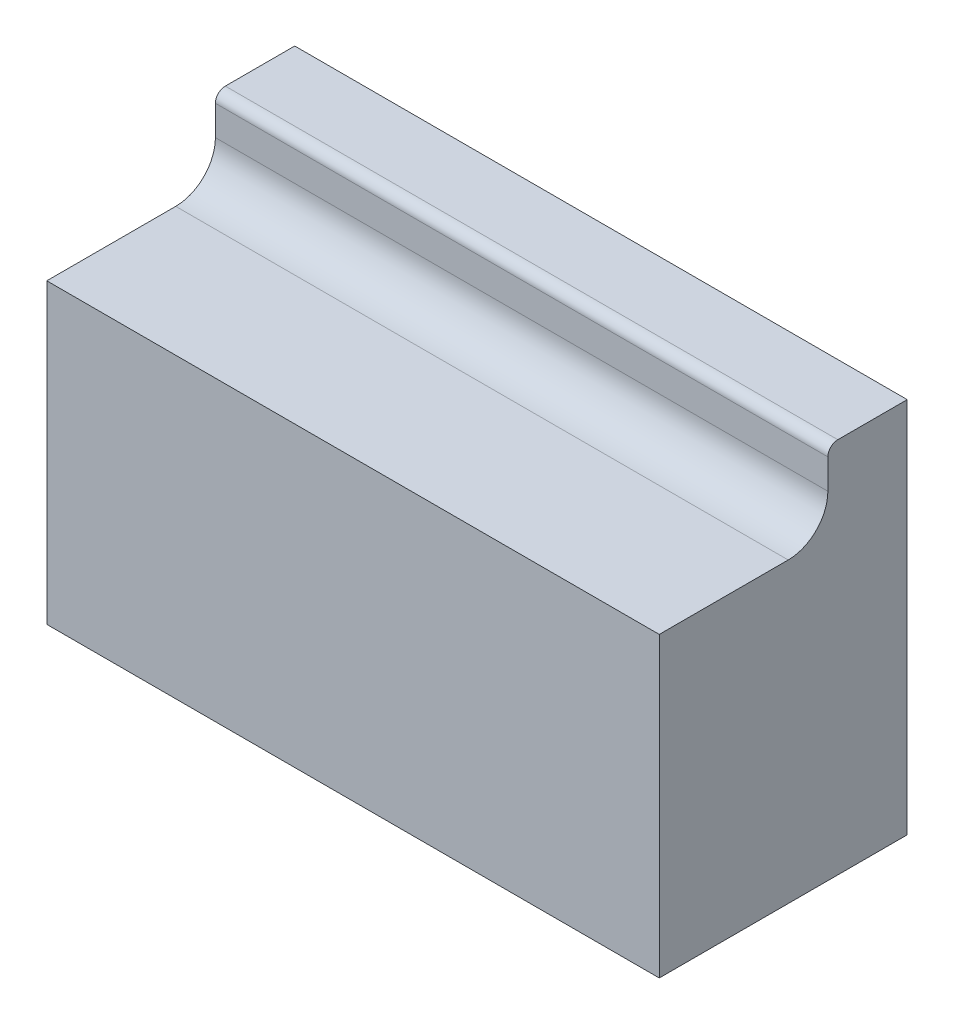
ISO-10303-21;
HEADER;
FILE_DESCRIPTION(('STEP AP214'),'2;1');
FILE_NAME('part.step','',(''),(''),'','','');
FILE_SCHEMA(('AUTOMOTIVE_DESIGN { 1 0 10303 214 1 1 1 1 }'));
ENDSEC;
DATA;
#1=APPLICATION_CONTEXT('core data for automotive mechanical design processes');
#2=APPLICATION_PROTOCOL_DEFINITION('international standard','automotive_design',2000,#1);
#3=PRODUCT_CONTEXT('',#1,'mechanical');
#4=PRODUCT('Part','Part','',(#3));
#5=PRODUCT_RELATED_PRODUCT_CATEGORY('part','',(#4));
#6=PRODUCT_DEFINITION_FORMATION('','',#4);
#7=PRODUCT_DEFINITION_CONTEXT('part definition',#1,'design');
#8=PRODUCT_DEFINITION('design','',#6,#7);
#9=PRODUCT_DEFINITION_SHAPE('','',#8);
#10=(LENGTH_UNIT() NAMED_UNIT(*) SI_UNIT(.MILLI.,.METRE.));
#11=(NAMED_UNIT(*) PLANE_ANGLE_UNIT() SI_UNIT($,.RADIAN.));
#12=(NAMED_UNIT(*) SI_UNIT($,.STERADIAN.) SOLID_ANGLE_UNIT());
#13=UNCERTAINTY_MEASURE_WITH_UNIT(LENGTH_MEASURE(1.E-05),#10,'distance_accuracy_value','');
#14=(GEOMETRIC_REPRESENTATION_CONTEXT(3) GLOBAL_UNCERTAINTY_ASSIGNED_CONTEXT((#13)) GLOBAL_UNIT_ASSIGNED_CONTEXT((#10,
#11,#12)) REPRESENTATION_CONTEXT('',''));
#15=CARTESIAN_POINT('',(0.,0.,0.));
#16=DIRECTION('',(0.,0.,1.));
#17=DIRECTION('',(1.,0.,0.));
#18=AXIS2_PLACEMENT_3D('',#15,#16,#17);
#19=CARTESIAN_POINT('',(5.71543778801842,-38.,12.5));
#20=DIRECTION('',(1.,0.,0.));
#21=DIRECTION('',(0.,1.,0.));
#22=AXIS2_PLACEMENT_3D('',#19,#20,#21);
#23=PLANE('',#22);
#24=DIRECTION('',(0.,-1.,0.));
#25=VECTOR('',#24,1.);
#26=CARTESIAN_POINT('',(5.71543778801842,-4.,-4.50000961496226));
#27=LINE('',#26,#25);
#28=CARTESIAN_POINT('',(5.71543778801843,-1.,-4.50000961496226));
#29=VERTEX_POINT('',#28);
#30=CARTESIAN_POINT('',(5.71543778801843,-4.,-4.50000961496226));
#31=VERTEX_POINT('',#30);
#32=EDGE_CURVE('E141',#29,#31,#27,.T.);
#33=ORIENTED_EDGE('',*,*,#32,.F.);
#34=CARTESIAN_POINT('',(5.71543778801843,-1.,-5.50000961496226));
#35=DIRECTION('',(1.,0.,0.));
#36=DIRECTION('',(0.,1.,0.));
#37=AXIS2_PLACEMENT_3D('',#34,#35,#36);
#38=CIRCLE('',#37,1.);
#39=CARTESIAN_POINT('',(5.71543778801843,0.,-5.50000961496226));
#40=VERTEX_POINT('',#39);
#41=EDGE_CURVE('E11',#29,#40,#38,.F.);
#42=ORIENTED_EDGE('',*,*,#41,.T.);
#43=DIRECTION('',(0.,0.,-1.));
#44=VECTOR('',#43,1.);
#45=CARTESIAN_POINT('',(5.71543778801843,0.,12.5));
#46=LINE('',#45,#44);
#47=CARTESIAN_POINT('',(5.71543778801843,0.,-12.5));
#48=VERTEX_POINT('',#47);
#49=EDGE_CURVE('E168',#40,#48,#46,.T.);
#50=ORIENTED_EDGE('',*,*,#49,.T.);
#51=DIRECTION('',(0.,-1.,0.));
#52=VECTOR('',#51,1.);
#53=CARTESIAN_POINT('',(5.71543778801842,-38.,-12.5));
#54=LINE('',#53,#52);
#55=CARTESIAN_POINT('',(5.71543778801842,-38.,-12.5));
#56=VERTEX_POINT('',#55);
#57=EDGE_CURVE('E159',#48,#56,#54,.T.);
#58=ORIENTED_EDGE('',*,*,#57,.T.);
#59=DIRECTION('',(0.,0.,-1.));
#60=VECTOR('',#59,1.);
#61=CARTESIAN_POINT('',(5.71543778801842,-38.,12.5));
#62=LINE('',#61,#60);
#63=CARTESIAN_POINT('',(5.71543778801842,-38.,12.5));
#64=VERTEX_POINT('',#63);
#65=EDGE_CURVE('E184',#64,#56,#62,.T.);
#66=ORIENTED_EDGE('',*,*,#65,.F.);
#67=DIRECTION('',(0.,-1.,0.));
#68=VECTOR('',#67,1.);
#69=CARTESIAN_POINT('',(5.71543778801842,-38.,12.5));
#70=LINE('',#69,#68);
#71=CARTESIAN_POINT('',(5.71543778801842,-8.,12.5));
#72=VERTEX_POINT('',#71);
#73=EDGE_CURVE('E160',#72,#64,#70,.T.);
#74=ORIENTED_EDGE('',*,*,#73,.F.);
#75=DIRECTION('',(0.,0.,1.));
#76=VECTOR('',#75,1.);
#77=CARTESIAN_POINT('',(5.71543778801842,-8.,12.5));
#78=LINE('',#77,#76);
#79=CARTESIAN_POINT('',(5.71543778801842,-8.,-0.500009614962257));
#80=VERTEX_POINT('',#79);
#81=EDGE_CURVE('E154',#80,#72,#78,.T.);
#82=ORIENTED_EDGE('',*,*,#81,.F.);
#83=CARTESIAN_POINT('',(5.71543778801842,-4.,-0.500009614962257));
#84=DIRECTION('',(1.,0.,0.));
#85=DIRECTION('',(0.,1.,0.));
#86=AXIS2_PLACEMENT_3D('',#83,#84,#85);
#87=CIRCLE('',#86,4.);
#88=EDGE_CURVE('E138',#31,#80,#87,.F.);
#89=ORIENTED_EDGE('',*,*,#88,.F.);
#90=EDGE_LOOP('',(#33,#42,#50,#58,#66,#74,#82,#89));
#91=FACE_BOUND('',#90,.T.);
#92=ADVANCED_FACE('F49',(#91),#23,.F.);
#93=CARTESIAN_POINT('',(5.71543778801842,-38.,12.5));
#94=DIRECTION('',(0.,1.,0.));
#95=DIRECTION('',(0.,0.,1.));
#96=AXIS2_PLACEMENT_3D('',#93,#94,#95);
#97=PLANE('',#96);
#98=CARTESIAN_POINT('',(57.5904377880184,-38.,0.));
#99=DIRECTION('',(0.,-1.,0.));
#100=DIRECTION('',(0.,0.,-1.));
#101=AXIS2_PLACEMENT_3D('',#98,#99,#100);
#102=CIRCLE('',#101,2.49999999999999);
#103=CARTESIAN_POINT('',(57.5904377880184,-38.,-2.49999999999998));
#104=VERTEX_POINT('',#103);
#105=EDGE_CURVE('E128',#104,#104,#102,.T.);
#106=ORIENTED_EDGE('',*,*,#105,.F.);
#107=EDGE_LOOP('',(#106));
#108=FACE_BOUND('',#107,.T.);
#109=CARTESIAN_POINT('',(15.5904377880184,-38.,0.));
#110=DIRECTION('',(0.,-1.,0.));
#111=DIRECTION('',(0.,0.,-1.));
#112=AXIS2_PLACEMENT_3D('',#109,#110,#111);
#113=CIRCLE('',#112,2.49999999999999);
#114=CARTESIAN_POINT('',(15.5904377880184,-38.,-2.49999999999999));
#115=VERTEX_POINT('',#114);
#116=EDGE_CURVE('E127',#115,#115,#113,.T.);
#117=ORIENTED_EDGE('',*,*,#116,.F.);
#118=EDGE_LOOP('',(#117));
#119=FACE_BOUND('',#118,.T.);
#120=DIRECTION('',(1.,0.,0.));
#121=VECTOR('',#120,1.);
#122=CARTESIAN_POINT('',(5.71543778801842,-38.,-12.5));
#123=LINE('',#122,#121);
#124=CARTESIAN_POINT('',(67.4654377880184,-38.,-12.5));
#125=VERTEX_POINT('',#124);
#126=EDGE_CURVE('E171',#56,#125,#123,.T.);
#127=ORIENTED_EDGE('',*,*,#126,.T.);
#128=DIRECTION('',(0.,0.,-1.));
#129=VECTOR('',#128,1.);
#130=CARTESIAN_POINT('',(67.4654377880184,-38.,12.5));
#131=LINE('',#130,#129);
#132=CARTESIAN_POINT('',(67.4654377880184,-38.,12.5));
#133=VERTEX_POINT('',#132);
#134=EDGE_CURVE('E181',#133,#125,#131,.T.);
#135=ORIENTED_EDGE('',*,*,#134,.F.);
#136=DIRECTION('',(1.,0.,0.));
#137=VECTOR('',#136,1.);
#138=CARTESIAN_POINT('',(5.71543778801842,-38.,12.5));
#139=LINE('',#138,#137);
#140=EDGE_CURVE('E162',#64,#133,#139,.T.);
#141=ORIENTED_EDGE('',*,*,#140,.F.);
#142=ORIENTED_EDGE('',*,*,#65,.T.);
#143=EDGE_LOOP('',(#127,#135,#141,#142));
#144=FACE_BOUND('',#143,.T.);
#145=ADVANCED_FACE('F223',(#108,#119,#144),#97,.F.);
#146=CARTESIAN_POINT('',(67.4654377880184,-38.,12.5));
#147=DIRECTION('',(-1.,0.,0.));
#148=DIRECTION('',(0.,0.,1.));
#149=AXIS2_PLACEMENT_3D('',#146,#147,#148);
#150=PLANE('',#149);
#151=DIRECTION('',(0.,0.,-1.));
#152=VECTOR('',#151,1.);
#153=CARTESIAN_POINT('',(67.4654377880184,0.,12.5));
#154=LINE('',#153,#152);
#155=CARTESIAN_POINT('',(67.4654377880184,0.,-5.50000961496226));
#156=VERTEX_POINT('',#155);
#157=CARTESIAN_POINT('',(67.4654377880184,0.,-12.5));
#158=VERTEX_POINT('',#157);
#159=EDGE_CURVE('E179',#156,#158,#154,.T.);
#160=ORIENTED_EDGE('',*,*,#159,.F.);
#161=CARTESIAN_POINT('',(67.4654377880184,-1.,-5.50000961496226));
#162=DIRECTION('',(-1.,0.,0.));
#163=DIRECTION('',(0.,0.,1.));
#164=AXIS2_PLACEMENT_3D('',#161,#162,#163);
#165=CIRCLE('',#164,1.);
#166=CARTESIAN_POINT('',(67.4654377880184,-1.,-4.50000961496226));
#167=VERTEX_POINT('',#166);
#168=EDGE_CURVE('E71',#156,#167,#165,.F.);
#169=ORIENTED_EDGE('',*,*,#168,.T.);
#170=DIRECTION('',(0.,1.,0.));
#171=VECTOR('',#170,1.);
#172=CARTESIAN_POINT('',(67.4654377880184,-4.,-4.50000961496226));
#173=LINE('',#172,#171);
#174=CARTESIAN_POINT('',(67.4654377880184,-4.,-4.50000961496226));
#175=VERTEX_POINT('',#174);
#176=EDGE_CURVE('E149',#175,#167,#173,.T.);
#177=ORIENTED_EDGE('',*,*,#176,.F.);
#178=CARTESIAN_POINT('',(67.4654377880184,-4.,-0.500009614962257));
#179=DIRECTION('',(1.,0.,0.));
#180=DIRECTION('',(0.,0.,-1.));
#181=AXIS2_PLACEMENT_3D('',#178,#179,#180);
#182=CIRCLE('',#181,4.);
#183=CARTESIAN_POINT('',(67.4654377880184,-8.,-0.500009614962257));
#184=VERTEX_POINT('',#183);
#185=EDGE_CURVE('E146',#184,#175,#182,.T.);
#186=ORIENTED_EDGE('',*,*,#185,.F.);
#187=DIRECTION('',(0.,0.,-1.));
#188=VECTOR('',#187,1.);
#189=CARTESIAN_POINT('',(67.4654377880184,-8.,12.5));
#190=LINE('',#189,#188);
#191=CARTESIAN_POINT('',(67.4654377880184,-8.,12.5));
#192=VERTEX_POINT('',#191);
#193=EDGE_CURVE('E143',#192,#184,#190,.T.);
#194=ORIENTED_EDGE('',*,*,#193,.F.);
#195=DIRECTION('',(0.,1.,0.));
#196=VECTOR('',#195,1.);
#197=CARTESIAN_POINT('',(67.4654377880184,-38.,12.5));
#198=LINE('',#197,#196);
#199=EDGE_CURVE('E165',#133,#192,#198,.T.);
#200=ORIENTED_EDGE('',*,*,#199,.F.);
#201=ORIENTED_EDGE('',*,*,#134,.T.);
#202=DIRECTION('',(0.,1.,0.));
#203=VECTOR('',#202,1.);
#204=CARTESIAN_POINT('',(67.4654377880184,-38.,-12.5));
#205=LINE('',#204,#203);
#206=EDGE_CURVE('E173',#125,#158,#205,.T.);
#207=ORIENTED_EDGE('',*,*,#206,.T.);
#208=EDGE_LOOP('',(#160,#169,#177,#186,#194,#200,#201,#207));
#209=FACE_BOUND('',#208,.T.);
#210=ADVANCED_FACE('F196',(#209),#150,.F.);
#211=CARTESIAN_POINT('',(5.71543778801843,0.,12.5));
#212=DIRECTION('',(0.,-1.,0.));
#213=DIRECTION('',(0.,0.,-1.));
#214=AXIS2_PLACEMENT_3D('',#211,#212,#213);
#215=PLANE('',#214);
#216=ORIENTED_EDGE('',*,*,#49,.F.);
#217=DIRECTION('',(1.,0.,0.));
#218=VECTOR('',#217,1.);
#219=CARTESIAN_POINT('',(5.71543778801843,0.,-5.50000961496226));
#220=LINE('',#219,#218);
#221=EDGE_CURVE('E187',#40,#156,#220,.T.);
#222=ORIENTED_EDGE('',*,*,#221,.T.);
#223=ORIENTED_EDGE('',*,*,#159,.T.);
#224=DIRECTION('',(-1.,0.,0.));
#225=VECTOR('',#224,1.);
#226=CARTESIAN_POINT('',(5.71543778801843,0.,-12.5));
#227=LINE('',#226,#225);
#228=EDGE_CURVE('E163',#158,#48,#227,.T.);
#229=ORIENTED_EDGE('',*,*,#228,.T.);
#230=EDGE_LOOP('',(#216,#222,#223,#229));
#231=FACE_BOUND('',#230,.T.);
#232=ADVANCED_FACE('F193',(#231),#215,.F.);
#233=CARTESIAN_POINT('',(0.,0.,12.5));
#234=DIRECTION('',(0.,0.,-1.));
#235=DIRECTION('',(-1.,0.,0.));
#236=AXIS2_PLACEMENT_3D('',#233,#234,#235);
#237=PLANE('',#236);
#238=ORIENTED_EDGE('',*,*,#199,.T.);
#239=DIRECTION('',(1.,0.,0.));
#240=VECTOR('',#239,1.);
#241=CARTESIAN_POINT('',(5.71443778801842,-8.,12.5));
#242=LINE('',#241,#240);
#243=EDGE_CURVE('E151',#72,#192,#242,.T.);
#244=ORIENTED_EDGE('',*,*,#243,.F.);
#245=ORIENTED_EDGE('',*,*,#73,.T.);
#246=ORIENTED_EDGE('',*,*,#140,.T.);
#247=EDGE_LOOP('',(#238,#244,#245,#246));
#248=FACE_BOUND('',#247,.T.);
#249=ADVANCED_FACE('F234',(#248),#237,.F.);
#250=CARTESIAN_POINT('',(0.,0.,-12.5));
#251=DIRECTION('',(0.,0.,-1.));
#252=DIRECTION('',(-1.,0.,0.));
#253=AXIS2_PLACEMENT_3D('',#250,#251,#252);
#254=PLANE('',#253);
#255=ORIENTED_EDGE('',*,*,#57,.F.);
#256=ORIENTED_EDGE('',*,*,#228,.F.);
#257=ORIENTED_EDGE('',*,*,#206,.F.);
#258=ORIENTED_EDGE('',*,*,#126,.F.);
#259=EDGE_LOOP('',(#255,#256,#257,#258));
#260=FACE_BOUND('',#259,.T.);
#261=ADVANCED_FACE('F203',(#260),#254,.T.);
#262=CARTESIAN_POINT('',(5.71443778801842,-4.,-4.50000961496226));
#263=DIRECTION('',(0.,0.,-1.));
#264=DIRECTION('',(-1.,0.,0.));
#265=AXIS2_PLACEMENT_3D('',#262,#263,#264);
#266=PLANE('',#265);
#267=ORIENTED_EDGE('',*,*,#176,.T.);
#268=DIRECTION('',(1.,0.,0.));
#269=VECTOR('',#268,1.);
#270=CARTESIAN_POINT('',(5.71443778801842,-1.,-4.50000961496226));
#271=LINE('',#270,#269);
#272=EDGE_CURVE('E57',#167,#29,#271,.F.);
#273=ORIENTED_EDGE('',*,*,#272,.T.);
#274=ORIENTED_EDGE('',*,*,#32,.T.);
#275=DIRECTION('',(1.,0.,0.));
#276=VECTOR('',#275,1.);
#277=CARTESIAN_POINT('',(5.71443778801842,-4.,-4.50000961496226));
#278=LINE('',#277,#276);
#279=EDGE_CURVE('E152',#31,#175,#278,.T.);
#280=ORIENTED_EDGE('',*,*,#279,.T.);
#281=EDGE_LOOP('',(#267,#273,#274,#280));
#282=FACE_BOUND('',#281,.T.);
#283=ADVANCED_FACE('F237',(#282),#266,.F.);
#284=CARTESIAN_POINT('',(5.71443778801842,-4.,-0.500009614962257));
#285=DIRECTION('',(1.,0.,0.));
#286=DIRECTION('',(0.,0.,-1.));
#287=AXIS2_PLACEMENT_3D('',#284,#285,#286);
#288=CYLINDRICAL_SURFACE('',#287,4.);
#289=ORIENTED_EDGE('',*,*,#88,.T.);
#290=DIRECTION('',(1.,0.,0.));
#291=VECTOR('',#290,1.);
#292=CARTESIAN_POINT('',(5.71443778801842,-8.,-0.500009614962257));
#293=LINE('',#292,#291);
#294=EDGE_CURVE('E155',#80,#184,#293,.T.);
#295=ORIENTED_EDGE('',*,*,#294,.T.);
#296=ORIENTED_EDGE('',*,*,#185,.T.);
#297=ORIENTED_EDGE('',*,*,#279,.F.);
#298=EDGE_LOOP('',(#289,#295,#296,#297));
#299=FACE_BOUND('',#298,.T.);
#300=ADVANCED_FACE('F219',(#299),#288,.F.);
#301=CARTESIAN_POINT('',(5.71443778801842,-8.,12.5));
#302=DIRECTION('',(0.,-1.,0.));
#303=DIRECTION('',(0.,0.,-1.));
#304=AXIS2_PLACEMENT_3D('',#301,#302,#303);
#305=PLANE('',#304);
#306=ORIENTED_EDGE('',*,*,#81,.T.);
#307=ORIENTED_EDGE('',*,*,#243,.T.);
#308=ORIENTED_EDGE('',*,*,#193,.T.);
#309=ORIENTED_EDGE('',*,*,#294,.F.);
#310=EDGE_LOOP('',(#306,#307,#308,#309));
#311=FACE_BOUND('',#310,.T.);
#312=ADVANCED_FACE('F210',(#311),#305,.F.);
#313=CARTESIAN_POINT('',(5.71543778801843,-1.,-5.50000961496226));
#314=DIRECTION('',(1.,0.,0.));
#315=DIRECTION('',(0.,0.,-1.));
#316=AXIS2_PLACEMENT_3D('',#313,#314,#315);
#317=CYLINDRICAL_SURFACE('',#316,1.);
#318=ORIENTED_EDGE('',*,*,#41,.F.);
#319=ORIENTED_EDGE('',*,*,#272,.F.);
#320=ORIENTED_EDGE('',*,*,#168,.F.);
#321=ORIENTED_EDGE('',*,*,#221,.F.);
#322=EDGE_LOOP('',(#318,#319,#320,#321));
#323=FACE_BOUND('',#322,.T.);
#324=ADVANCED_FACE('F51',(#323),#317,.T.);
#325=CARTESIAN_POINT('',(15.5904377880184,-21.,0.));
#326=DIRECTION('',(0.,-1.,0.));
#327=DIRECTION('',(0.,0.,-1.));
#328=AXIS2_PLACEMENT_3D('',#325,#326,#327);
#329=CONICAL_SURFACE('',#328,2.49999999999999,1.02974425867665);
#330=CARTESIAN_POINT('',(15.5904377880184,-19.4978484524311,0.));
#331=VERTEX_POINT('',#330);
#332=VERTEX_LOOP('',#331);
#333=FACE_BOUND('',#332,.T.);
#334=CARTESIAN_POINT('',(15.5904377880184,-21.,0.));
#335=DIRECTION('',(0.,-1.,0.));
#336=DIRECTION('',(0.,0.,-1.));
#337=AXIS2_PLACEMENT_3D('',#334,#335,#336);
#338=CIRCLE('',#337,2.49999999999999);
#339=CARTESIAN_POINT('',(15.5904377880184,-21.,-2.49999999999999));
#340=VERTEX_POINT('',#339);
#341=EDGE_CURVE('E131',#340,#340,#338,.T.);
#342=ORIENTED_EDGE('',*,*,#341,.T.);
#343=EDGE_LOOP('',(#342));
#344=FACE_BOUND('',#343,.T.);
#345=ADVANCED_FACE('F209',(#333,#344),#329,.F.);
#346=CARTESIAN_POINT('',(15.5904377880184,-38.,0.));
#347=DIRECTION('',(0.,-1.,0.));
#348=DIRECTION('',(0.,0.,-1.));
#349=AXIS2_PLACEMENT_3D('',#346,#347,#348);
#350=CYLINDRICAL_SURFACE('',#349,2.49999999999999);
#351=ORIENTED_EDGE('',*,*,#341,.F.);
#352=EDGE_LOOP('',(#351));
#353=FACE_BOUND('',#352,.T.);
#354=ORIENTED_EDGE('',*,*,#116,.T.);
#355=EDGE_LOOP('',(#354));
#356=FACE_BOUND('',#355,.T.);
#357=ADVANCED_FACE('F121',(#353,#356),#350,.F.);
#358=CARTESIAN_POINT('',(57.5904377880184,-21.,0.));
#359=DIRECTION('',(0.,-1.,0.));
#360=DIRECTION('',(0.,0.,-1.));
#361=AXIS2_PLACEMENT_3D('',#358,#359,#360);
#362=CONICAL_SURFACE('',#361,2.49999999999999,1.02974425867665);
#363=CARTESIAN_POINT('',(57.5904377880184,-19.4978484524311,0.));
#364=VERTEX_POINT('',#363);
#365=VERTEX_LOOP('',#364);
#366=FACE_BOUND('',#365,.T.);
#367=CARTESIAN_POINT('',(57.5904377880184,-21.,0.));
#368=DIRECTION('',(0.,-1.,0.));
#369=DIRECTION('',(0.,0.,-1.));
#370=AXIS2_PLACEMENT_3D('',#367,#368,#369);
#371=CIRCLE('',#370,2.49999999999999);
#372=CARTESIAN_POINT('',(57.5904377880184,-21.,-2.49999999999998));
#373=VERTEX_POINT('',#372);
#374=EDGE_CURVE('E125',#373,#373,#371,.T.);
#375=ORIENTED_EDGE('',*,*,#374,.T.);
#376=EDGE_LOOP('',(#375));
#377=FACE_BOUND('',#376,.T.);
#378=ADVANCED_FACE('F117',(#366,#377),#362,.F.);
#379=CARTESIAN_POINT('',(57.5904377880184,-38.,0.));
#380=DIRECTION('',(0.,-1.,0.));
#381=DIRECTION('',(0.,0.,-1.));
#382=AXIS2_PLACEMENT_3D('',#379,#380,#381);
#383=CYLINDRICAL_SURFACE('',#382,2.49999999999999);
#384=ORIENTED_EDGE('',*,*,#374,.F.);
#385=EDGE_LOOP('',(#384));
#386=FACE_BOUND('',#385,.T.);
#387=ORIENTED_EDGE('',*,*,#105,.T.);
#388=EDGE_LOOP('',(#387));
#389=FACE_BOUND('',#388,.T.);
#390=ADVANCED_FACE('F120',(#386,#389),#383,.F.);
#391=CLOSED_SHELL('',(#92,#145,#210,#232,#249,#261,#283,#300,#312,#324,#345,#357,#378,#390));
#392=MANIFOLD_SOLID_BREP('B2',#391);
#393=ADVANCED_BREP_SHAPE_REPRESENTATION('',(#18,#392),#14);
#394=SHAPE_DEFINITION_REPRESENTATION(#9,#393);
ENDSEC;
END-ISO-10303-21;
